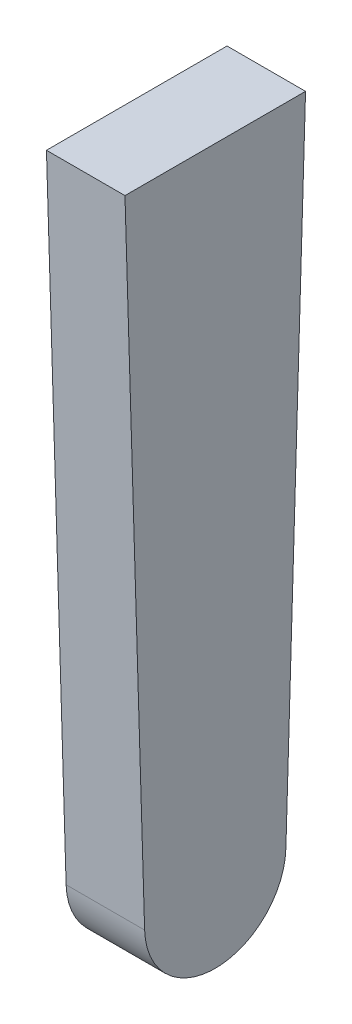
ISO-10303-21;
HEADER;
FILE_DESCRIPTION(('STEP AP214'),'2;1');
FILE_NAME('part.step','',(''),(''),'','','');
FILE_SCHEMA(('AUTOMOTIVE_DESIGN { 1 0 10303 214 1 1 1 1 }'));
ENDSEC;
DATA;
#1=APPLICATION_CONTEXT('core data for automotive mechanical design processes');
#2=APPLICATION_PROTOCOL_DEFINITION('international standard','automotive_design',2000,#1);
#3=PRODUCT_CONTEXT('',#1,'mechanical');
#4=PRODUCT('Part','Part','',(#3));
#5=PRODUCT_RELATED_PRODUCT_CATEGORY('part','',(#4));
#6=PRODUCT_DEFINITION_FORMATION('','',#4);
#7=PRODUCT_DEFINITION_CONTEXT('part definition',#1,'design');
#8=PRODUCT_DEFINITION('design','',#6,#7);
#9=PRODUCT_DEFINITION_SHAPE('','',#8);
#10=(LENGTH_UNIT() NAMED_UNIT(*) SI_UNIT(.MILLI.,.METRE.));
#11=(NAMED_UNIT(*) PLANE_ANGLE_UNIT() SI_UNIT($,.RADIAN.));
#12=(NAMED_UNIT(*) SI_UNIT($,.STERADIAN.) SOLID_ANGLE_UNIT());
#13=UNCERTAINTY_MEASURE_WITH_UNIT(LENGTH_MEASURE(1.E-05),#10,'distance_accuracy_value','');
#14=(GEOMETRIC_REPRESENTATION_CONTEXT(3) GLOBAL_UNCERTAINTY_ASSIGNED_CONTEXT((#13)) GLOBAL_UNIT_ASSIGNED_CONTEXT((#10,
#11,#12)) REPRESENTATION_CONTEXT('',''));
#15=CARTESIAN_POINT('',(0.,0.,0.));
#16=DIRECTION('',(0.,0.,1.));
#17=DIRECTION('',(1.,0.,0.));
#18=AXIS2_PLACEMENT_3D('',#15,#16,#17);
#19=CARTESIAN_POINT('',(11.176,0.4572,0.));
#20=DIRECTION('',(0.,1.,0.));
#21=DIRECTION('',(1.,0.,0.));
#22=AXIS2_PLACEMENT_3D('',#19,#20,#21);
#23=PLANE('',#22);
#24=DIRECTION('',(0.,0.,-1.));
#25=VECTOR('',#24,1.);
#26=CARTESIAN_POINT('',(10.668,0.4572,0.));
#27=LINE('',#26,#25);
#28=CARTESIAN_POINT('',(10.668,0.4572,0.5842));
#29=VERTEX_POINT('',#28);
#30=CARTESIAN_POINT('',(10.668,0.4572,-0.5842));
#31=VERTEX_POINT('',#30);
#32=EDGE_CURVE('E84',#29,#31,#27,.T.);
#33=ORIENTED_EDGE('',*,*,#32,.F.);
#34=DIRECTION('',(-1.,0.,0.));
#35=VECTOR('',#34,1.);
#36=CARTESIAN_POINT('',(11.176,0.4572,0.5842));
#37=LINE('',#36,#35);
#38=CARTESIAN_POINT('',(11.176,0.4572,0.5842));
#39=VERTEX_POINT('',#38);
#40=EDGE_CURVE('E11',#39,#29,#37,.T.);
#41=ORIENTED_EDGE('',*,*,#40,.F.);
#42=DIRECTION('',(0.,0.,-1.));
#43=VECTOR('',#42,1.);
#44=CARTESIAN_POINT('',(11.176,0.4572,0.));
#45=LINE('',#44,#43);
#46=CARTESIAN_POINT('',(11.176,0.4572,-0.5842));
#47=VERTEX_POINT('',#46);
#48=EDGE_CURVE('E87',#39,#47,#45,.T.);
#49=ORIENTED_EDGE('',*,*,#48,.T.);
#50=DIRECTION('',(-1.,0.,0.));
#51=VECTOR('',#50,1.);
#52=CARTESIAN_POINT('',(11.176,0.4572,-0.5842));
#53=LINE('',#52,#51);
#54=EDGE_CURVE('E89',#47,#31,#53,.T.);
#55=ORIENTED_EDGE('',*,*,#54,.T.);
#56=EDGE_LOOP('',(#33,#41,#49,#55));
#57=FACE_BOUND('',#56,.T.);
#58=ADVANCED_FACE('F17',(#57),#23,.T.);
#59=CARTESIAN_POINT('',(11.176,-0.01734166208085,0.5697563863));
#60=DIRECTION('',(0.,0.0304228883320503,-0.999537116802341));
#61=DIRECTION('',(-1.,0.,0.));
#62=AXIS2_PLACEMENT_3D('',#59,#60,#61);
#63=PLANE('',#62);
#64=DIRECTION('',(0.,-0.999537116802341,-0.0304228883320503));
#65=VECTOR('',#64,1.);
#66=CARTESIAN_POINT('',(10.668,-0.01734166208085,0.5697563863));
#67=LINE('',#66,#65);
#68=CARTESIAN_POINT('',(10.668,-3.722309344545,0.456988369802));
#69=VERTEX_POINT('',#68);
#70=EDGE_CURVE('E72',#29,#69,#67,.T.);
#71=ORIENTED_EDGE('',*,*,#70,.T.);
#72=DIRECTION('',(-1.,0.,0.));
#73=VECTOR('',#72,1.);
#74=CARTESIAN_POINT('',(11.176,-3.722309344545,0.456988369802));
#75=LINE('',#74,#73);
#76=CARTESIAN_POINT('',(11.176,-3.722309344545,0.456988369802));
#77=VERTEX_POINT('',#76);
#78=EDGE_CURVE('E20',#77,#69,#75,.T.);
#79=ORIENTED_EDGE('',*,*,#78,.F.);
#80=DIRECTION('',(0.,-0.999537116802341,-0.0304228883320503));
#81=VECTOR('',#80,1.);
#82=CARTESIAN_POINT('',(11.176,-0.01734166208085,0.5697563863));
#83=LINE('',#82,#81);
#84=EDGE_CURVE('E75',#39,#77,#83,.T.);
#85=ORIENTED_EDGE('',*,*,#84,.F.);
#86=ORIENTED_EDGE('',*,*,#40,.T.);
#87=EDGE_LOOP('',(#71,#79,#85,#86));
#88=FACE_BOUND('',#87,.T.);
#89=ADVANCED_FACE('F71',(#88),#63,.F.);
#90=CARTESIAN_POINT('',(11.176,-3.7084,0.));
#91=DIRECTION('',(-1.,0.,0.));
#92=DIRECTION('',(0.,0.,1.));
#93=AXIS2_PLACEMENT_3D('',#90,#91,#92);
#94=CYLINDRICAL_SURFACE('',#93,0.4572);
#95=CARTESIAN_POINT('',(10.668,-3.7084,0.));
#96=DIRECTION('',(1.,0.,0.));
#97=DIRECTION('',(0.,0.,-1.));
#98=AXIS2_PLACEMENT_3D('',#95,#96,#97);
#99=CIRCLE('',#98,0.4572);
#100=CARTESIAN_POINT('',(10.668,-3.722309344545,-0.456988369802));
#101=VERTEX_POINT('',#100);
#102=EDGE_CURVE('E85',#69,#101,#99,.T.);
#103=ORIENTED_EDGE('',*,*,#102,.T.);
#104=DIRECTION('',(-1.,0.,0.));
#105=VECTOR('',#104,1.);
#106=CARTESIAN_POINT('',(11.176,-3.722309344545,-0.456988369802));
#107=LINE('',#106,#105);
#108=CARTESIAN_POINT('',(11.176,-3.722309344545,-0.456988369802));
#109=VERTEX_POINT('',#108);
#110=EDGE_CURVE('E39',#109,#101,#107,.T.);
#111=ORIENTED_EDGE('',*,*,#110,.F.);
#112=CARTESIAN_POINT('',(11.176,-3.7084,0.));
#113=DIRECTION('',(1.,0.,0.));
#114=DIRECTION('',(0.,0.,-1.));
#115=AXIS2_PLACEMENT_3D('',#112,#113,#114);
#116=CIRCLE('',#115,0.4572);
#117=EDGE_CURVE('E108',#77,#109,#116,.T.);
#118=ORIENTED_EDGE('',*,*,#117,.F.);
#119=ORIENTED_EDGE('',*,*,#78,.T.);
#120=EDGE_LOOP('',(#103,#111,#118,#119));
#121=FACE_BOUND('',#120,.T.);
#122=ADVANCED_FACE('F153',(#121),#94,.T.);
#123=CARTESIAN_POINT('',(11.176,-0.01734166208085,-0.5697563863));
#124=DIRECTION('',(0.,-0.0304228883320503,-0.999537116802341));
#125=DIRECTION('',(0.,-0.999537116802341,0.0304228883320503));
#126=AXIS2_PLACEMENT_3D('',#123,#124,#125);
#127=PLANE('',#126);
#128=DIRECTION('',(0.,-0.999537116802341,0.0304228883320503));
#129=VECTOR('',#128,1.);
#130=CARTESIAN_POINT('',(10.668,-0.01734166208085,-0.5697563863));
#131=LINE('',#130,#129);
#132=EDGE_CURVE('E91',#31,#101,#131,.T.);
#133=ORIENTED_EDGE('',*,*,#132,.F.);
#134=ORIENTED_EDGE('',*,*,#54,.F.);
#135=DIRECTION('',(0.,-0.999537116802341,0.0304228883320503));
#136=VECTOR('',#135,1.);
#137=CARTESIAN_POINT('',(11.176,-0.01734166208085,-0.5697563863));
#138=LINE('',#137,#136);
#139=EDGE_CURVE('E100',#47,#109,#138,.T.);
#140=ORIENTED_EDGE('',*,*,#139,.T.);
#141=ORIENTED_EDGE('',*,*,#110,.T.);
#142=EDGE_LOOP('',(#133,#134,#140,#141));
#143=FACE_BOUND('',#142,.T.);
#144=ADVANCED_FACE('F142',(#143),#127,.T.);
#145=CARTESIAN_POINT('',(11.176,0.,0.));
#146=DIRECTION('',(1.,0.,0.));
#147=DIRECTION('',(0.,1.,0.));
#148=AXIS2_PLACEMENT_3D('',#145,#146,#147);
#149=PLANE('',#148);
#150=ORIENTED_EDGE('',*,*,#48,.F.);
#151=ORIENTED_EDGE('',*,*,#84,.T.);
#152=ORIENTED_EDGE('',*,*,#117,.T.);
#153=ORIENTED_EDGE('',*,*,#139,.F.);
#154=EDGE_LOOP('',(#150,#151,#152,#153));
#155=FACE_BOUND('',#154,.T.);
#156=ADVANCED_FACE('F132',(#155),#149,.T.);
#157=CARTESIAN_POINT('',(10.668,0.,0.));
#158=DIRECTION('',(1.,0.,0.));
#159=DIRECTION('',(0.,1.,0.));
#160=AXIS2_PLACEMENT_3D('',#157,#158,#159);
#161=PLANE('',#160);
#162=ORIENTED_EDGE('',*,*,#32,.T.);
#163=ORIENTED_EDGE('',*,*,#132,.T.);
#164=ORIENTED_EDGE('',*,*,#102,.F.);
#165=ORIENTED_EDGE('',*,*,#70,.F.);
#166=EDGE_LOOP('',(#162,#163,#164,#165));
#167=FACE_BOUND('',#166,.T.);
#168=ADVANCED_FACE('F82',(#167),#161,.F.);
#169=CLOSED_SHELL('',(#58,#89,#122,#144,#156,#168));
#170=MANIFOLD_SOLID_BREP('B1',#169);
#171=ADVANCED_BREP_SHAPE_REPRESENTATION('',(#18,#170),#14);
#172=SHAPE_DEFINITION_REPRESENTATION(#9,#171);
ENDSEC;
END-ISO-10303-21;
